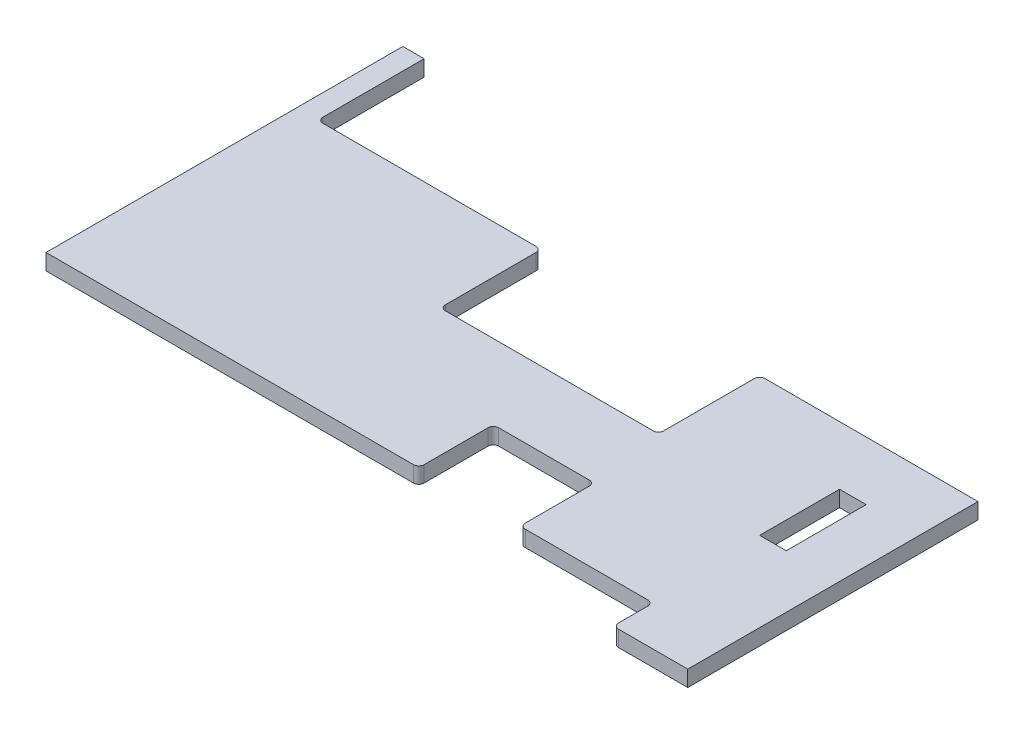
ISO-10303-21;
HEADER;
FILE_DESCRIPTION(('STEP AP214'),'2;1');
FILE_NAME('part.step','',(''),(''),'','','');
FILE_SCHEMA(('AUTOMOTIVE_DESIGN { 1 0 10303 214 1 1 1 1 }'));
ENDSEC;
DATA;
#1=APPLICATION_CONTEXT('core data for automotive mechanical design processes');
#2=APPLICATION_PROTOCOL_DEFINITION('international standard','automotive_design',2000,#1);
#3=PRODUCT_CONTEXT('',#1,'mechanical');
#4=PRODUCT('Part','Part','',(#3));
#5=PRODUCT_RELATED_PRODUCT_CATEGORY('part','',(#4));
#6=PRODUCT_DEFINITION_FORMATION('','',#4);
#7=PRODUCT_DEFINITION_CONTEXT('part definition',#1,'design');
#8=PRODUCT_DEFINITION('design','',#6,#7);
#9=PRODUCT_DEFINITION_SHAPE('','',#8);
#10=(LENGTH_UNIT() NAMED_UNIT(*) SI_UNIT(.MILLI.,.METRE.));
#11=(NAMED_UNIT(*) PLANE_ANGLE_UNIT() SI_UNIT($,.RADIAN.));
#12=(NAMED_UNIT(*) SI_UNIT($,.STERADIAN.) SOLID_ANGLE_UNIT());
#13=UNCERTAINTY_MEASURE_WITH_UNIT(LENGTH_MEASURE(1.E-05),#10,'distance_accuracy_value','');
#14=(GEOMETRIC_REPRESENTATION_CONTEXT(3) GLOBAL_UNCERTAINTY_ASSIGNED_CONTEXT((#13)) GLOBAL_UNIT_ASSIGNED_CONTEXT((#10,
#11,#12)) REPRESENTATION_CONTEXT('',''));
#15=CARTESIAN_POINT('',(0.,0.,0.));
#16=DIRECTION('',(0.,0.,1.));
#17=DIRECTION('',(1.,0.,0.));
#18=AXIS2_PLACEMENT_3D('',#15,#16,#17);
#19=CARTESIAN_POINT('',(0.,3.,-67.));
#20=DIRECTION('',(1.,0.,0.));
#21=DIRECTION('',(0.,0.,-1.));
#22=AXIS2_PLACEMENT_3D('',#19,#20,#21);
#23=PLANE('',#22);
#24=DIRECTION('',(0.,0.,1.));
#25=VECTOR('',#24,1.);
#26=CARTESIAN_POINT('',(0.,0.,-67.));
#27=LINE('',#26,#25);
#28=CARTESIAN_POINT('',(0.,0.,-67.));
#29=VERTEX_POINT('',#28);
#30=CARTESIAN_POINT('',(0.,0.,0.));
#31=VERTEX_POINT('',#30);
#32=EDGE_CURVE('E299',#29,#31,#27,.T.);
#33=ORIENTED_EDGE('',*,*,#32,.T.);
#34=DIRECTION('',(0.,-1.,0.));
#35=VECTOR('',#34,1.);
#36=CARTESIAN_POINT('',(0.,3.,0.));
#37=LINE('',#36,#35);
#38=CARTESIAN_POINT('',(0.,3.,0.));
#39=VERTEX_POINT('',#38);
#40=EDGE_CURVE('E438',#39,#31,#37,.T.);
#41=ORIENTED_EDGE('',*,*,#40,.F.);
#42=DIRECTION('',(0.,0.,1.));
#43=VECTOR('',#42,1.);
#44=CARTESIAN_POINT('',(0.,3.,-67.));
#45=LINE('',#44,#43);
#46=CARTESIAN_POINT('',(0.,3.,-67.));
#47=VERTEX_POINT('',#46);
#48=EDGE_CURVE('E305',#47,#39,#45,.T.);
#49=ORIENTED_EDGE('',*,*,#48,.F.);
#50=DIRECTION('',(0.,-1.,0.));
#51=VECTOR('',#50,1.);
#52=CARTESIAN_POINT('',(0.,3.,-67.));
#53=LINE('',#52,#51);
#54=EDGE_CURVE('E365',#47,#29,#53,.T.);
#55=ORIENTED_EDGE('',*,*,#54,.T.);
#56=EDGE_LOOP('',(#33,#41,#49,#55));
#57=FACE_BOUND('',#56,.T.);
#58=ADVANCED_FACE('F45',(#57),#23,.F.);
#59=CARTESIAN_POINT('',(70.,3.,0.));
#60=DIRECTION('',(0.,0.,-1.));
#61=DIRECTION('',(-1.,0.,0.));
#62=AXIS2_PLACEMENT_3D('',#59,#60,#61);
#63=PLANE('',#62);
#64=DIRECTION('',(1.,0.,0.));
#65=VECTOR('',#64,1.);
#66=CARTESIAN_POINT('',(70.,0.,0.));
#67=LINE('',#66,#65);
#68=CARTESIAN_POINT('',(69.,0.,0.));
#69=VERTEX_POINT('',#68);
#70=EDGE_CURVE('E369',#31,#69,#67,.T.);
#71=ORIENTED_EDGE('',*,*,#70,.T.);
#72=DIRECTION('',(0.,-1.,0.));
#73=VECTOR('',#72,1.);
#74=CARTESIAN_POINT('',(69.,3.,0.));
#75=LINE('',#74,#73);
#76=CARTESIAN_POINT('',(69.,3.,0.));
#77=VERTEX_POINT('',#76);
#78=EDGE_CURVE('E504',#69,#77,#75,.F.);
#79=ORIENTED_EDGE('',*,*,#78,.T.);
#80=DIRECTION('',(1.,0.,0.));
#81=VECTOR('',#80,1.);
#82=CARTESIAN_POINT('',(70.,3.,0.));
#83=LINE('',#82,#81);
#84=EDGE_CURVE('E309',#39,#77,#83,.T.);
#85=ORIENTED_EDGE('',*,*,#84,.F.);
#86=ORIENTED_EDGE('',*,*,#40,.T.);
#87=EDGE_LOOP('',(#71,#79,#85,#86));
#88=FACE_BOUND('',#87,.T.);
#89=ADVANCED_FACE('F599',(#88),#63,.F.);
#90=CARTESIAN_POINT('',(70.,3.,-14.));
#91=DIRECTION('',(-1.,0.,0.));
#92=DIRECTION('',(0.,0.,1.));
#93=AXIS2_PLACEMENT_3D('',#90,#91,#92);
#94=PLANE('',#93);
#95=DIRECTION('',(0.,0.,-1.));
#96=VECTOR('',#95,1.);
#97=CARTESIAN_POINT('',(70.,3.,-14.));
#98=LINE('',#97,#96);
#99=CARTESIAN_POINT('',(70.,3.,-1.));
#100=VERTEX_POINT('',#99);
#101=CARTESIAN_POINT('',(70.,3.,-13.));
#102=VERTEX_POINT('',#101);
#103=EDGE_CURVE('E314',#100,#102,#98,.T.);
#104=ORIENTED_EDGE('',*,*,#103,.F.);
#105=DIRECTION('',(0.,-1.,0.));
#106=VECTOR('',#105,1.);
#107=CARTESIAN_POINT('',(70.,3.,-1.));
#108=LINE('',#107,#106);
#109=CARTESIAN_POINT('',(70.,0.,-1.));
#110=VERTEX_POINT('',#109);
#111=EDGE_CURVE('E500',#100,#110,#108,.T.);
#112=ORIENTED_EDGE('',*,*,#111,.T.);
#113=DIRECTION('',(0.,0.,-1.));
#114=VECTOR('',#113,1.);
#115=CARTESIAN_POINT('',(70.,0.,-14.));
#116=LINE('',#115,#114);
#117=CARTESIAN_POINT('',(70.,0.,-13.));
#118=VERTEX_POINT('',#117);
#119=EDGE_CURVE('E373',#110,#118,#116,.T.);
#120=ORIENTED_EDGE('',*,*,#119,.T.);
#121=DIRECTION('',(0.,-1.,0.));
#122=VECTOR('',#121,1.);
#123=CARTESIAN_POINT('',(70.,3.,-13.));
#124=LINE('',#123,#122);
#125=EDGE_CURVE('E497',#118,#102,#124,.F.);
#126=ORIENTED_EDGE('',*,*,#125,.T.);
#127=EDGE_LOOP('',(#104,#112,#120,#126));
#128=FACE_BOUND('',#127,.T.);
#129=ADVANCED_FACE('F608',(#128),#94,.F.);
#130=CARTESIAN_POINT('',(89.,3.,-14.));
#131=DIRECTION('',(0.,0.,-1.));
#132=DIRECTION('',(-1.,0.,0.));
#133=AXIS2_PLACEMENT_3D('',#130,#131,#132);
#134=PLANE('',#133);
#135=DIRECTION('',(1.,0.,0.));
#136=VECTOR('',#135,1.);
#137=CARTESIAN_POINT('',(89.,0.,-14.));
#138=LINE('',#137,#136);
#139=CARTESIAN_POINT('',(71.,0.,-14.));
#140=VERTEX_POINT('',#139);
#141=CARTESIAN_POINT('',(88.,0.,-14.));
#142=VERTEX_POINT('',#141);
#143=EDGE_CURVE('E377',#140,#142,#138,.T.);
#144=ORIENTED_EDGE('',*,*,#143,.T.);
#145=DIRECTION('',(0.,-1.,0.));
#146=VECTOR('',#145,1.);
#147=CARTESIAN_POINT('',(88.,3.,-14.));
#148=LINE('',#147,#146);
#149=CARTESIAN_POINT('',(88.,3.,-14.));
#150=VERTEX_POINT('',#149);
#151=EDGE_CURVE('E511',#142,#150,#148,.F.);
#152=ORIENTED_EDGE('',*,*,#151,.T.);
#153=DIRECTION('',(1.,0.,0.));
#154=VECTOR('',#153,1.);
#155=CARTESIAN_POINT('',(89.,3.,-14.));
#156=LINE('',#155,#154);
#157=CARTESIAN_POINT('',(71.,3.,-14.));
#158=VERTEX_POINT('',#157);
#159=EDGE_CURVE('E318',#158,#150,#156,.T.);
#160=ORIENTED_EDGE('',*,*,#159,.F.);
#161=DIRECTION('',(0.,-1.,0.));
#162=VECTOR('',#161,1.);
#163=CARTESIAN_POINT('',(71.,0.,-14.));
#164=LINE('',#163,#162);
#165=EDGE_CURVE('E507',#158,#140,#164,.T.);
#166=ORIENTED_EDGE('',*,*,#165,.T.);
#167=EDGE_LOOP('',(#144,#152,#160,#166));
#168=FACE_BOUND('',#167,.T.);
#169=ADVANCED_FACE('F617',(#168),#134,.F.);
#170=CARTESIAN_POINT('',(89.,3.,0.));
#171=DIRECTION('',(1.,0.,0.));
#172=DIRECTION('',(0.,0.,-1.));
#173=AXIS2_PLACEMENT_3D('',#170,#171,#172);
#174=PLANE('',#173);
#175=DIRECTION('',(0.,0.,1.));
#176=VECTOR('',#175,1.);
#177=CARTESIAN_POINT('',(89.,0.,0.));
#178=LINE('',#177,#176);
#179=CARTESIAN_POINT('',(89.,0.,-13.));
#180=VERTEX_POINT('',#179);
#181=CARTESIAN_POINT('',(89.,0.,-1.));
#182=VERTEX_POINT('',#181);
#183=EDGE_CURVE('E381',#180,#182,#178,.T.);
#184=ORIENTED_EDGE('',*,*,#183,.T.);
#185=DIRECTION('',(0.,-1.,0.));
#186=VECTOR('',#185,1.);
#187=CARTESIAN_POINT('',(89.,3.,-1.));
#188=LINE('',#187,#186);
#189=CARTESIAN_POINT('',(89.,3.,-1.));
#190=VERTEX_POINT('',#189);
#191=EDGE_CURVE('E494',#182,#190,#188,.F.);
#192=ORIENTED_EDGE('',*,*,#191,.T.);
#193=DIRECTION('',(0.,0.,1.));
#194=VECTOR('',#193,1.);
#195=CARTESIAN_POINT('',(89.,3.,0.));
#196=LINE('',#195,#194);
#197=CARTESIAN_POINT('',(89.,3.,-13.));
#198=VERTEX_POINT('',#197);
#199=EDGE_CURVE('E322',#198,#190,#196,.T.);
#200=ORIENTED_EDGE('',*,*,#199,.F.);
#201=DIRECTION('',(0.,-1.,0.));
#202=VECTOR('',#201,1.);
#203=CARTESIAN_POINT('',(89.,0.,-13.));
#204=LINE('',#203,#202);
#205=EDGE_CURVE('E490',#198,#180,#204,.T.);
#206=ORIENTED_EDGE('',*,*,#205,.T.);
#207=EDGE_LOOP('',(#184,#192,#200,#206));
#208=FACE_BOUND('',#207,.T.);
#209=ADVANCED_FACE('F626',(#208),#174,.F.);
#210=CARTESIAN_POINT('',(114.,3.,0.));
#211=DIRECTION('',(0.,0.,-1.));
#212=DIRECTION('',(-1.,0.,0.));
#213=AXIS2_PLACEMENT_3D('',#210,#211,#212);
#214=PLANE('',#213);
#215=DIRECTION('',(1.,0.,0.));
#216=VECTOR('',#215,1.);
#217=CARTESIAN_POINT('',(114.,0.,0.));
#218=LINE('',#217,#216);
#219=CARTESIAN_POINT('',(90.,0.,0.));
#220=VERTEX_POINT('',#219);
#221=CARTESIAN_POINT('',(113.,0.,0.));
#222=VERTEX_POINT('',#221);
#223=EDGE_CURVE('E385',#220,#222,#218,.T.);
#224=ORIENTED_EDGE('',*,*,#223,.T.);
#225=DIRECTION('',(0.,-1.,0.));
#226=VECTOR('',#225,1.);
#227=CARTESIAN_POINT('',(113.,3.,0.));
#228=LINE('',#227,#226);
#229=CARTESIAN_POINT('',(113.,3.,0.));
#230=VERTEX_POINT('',#229);
#231=EDGE_CURVE('E487',#222,#230,#228,.F.);
#232=ORIENTED_EDGE('',*,*,#231,.T.);
#233=DIRECTION('',(1.,0.,0.));
#234=VECTOR('',#233,1.);
#235=CARTESIAN_POINT('',(114.,3.,0.));
#236=LINE('',#235,#234);
#237=CARTESIAN_POINT('',(90.,3.,0.));
#238=VERTEX_POINT('',#237);
#239=EDGE_CURVE('E326',#238,#230,#236,.T.);
#240=ORIENTED_EDGE('',*,*,#239,.F.);
#241=DIRECTION('',(0.,-1.,0.));
#242=VECTOR('',#241,1.);
#243=CARTESIAN_POINT('',(90.,3.,0.));
#244=LINE('',#243,#242);
#245=EDGE_CURVE('E483',#238,#220,#244,.T.);
#246=ORIENTED_EDGE('',*,*,#245,.T.);
#247=EDGE_LOOP('',(#224,#232,#240,#246));
#248=FACE_BOUND('',#247,.T.);
#249=ADVANCED_FACE('F635',(#248),#214,.F.);
#250=CARTESIAN_POINT('',(114.,3.,7.49999999999999));
#251=DIRECTION('',(1.,0.,0.));
#252=DIRECTION('',(0.,0.,-1.));
#253=AXIS2_PLACEMENT_3D('',#250,#251,#252);
#254=PLANE('',#253);
#255=DIRECTION('',(0.,0.,1.));
#256=VECTOR('',#255,1.);
#257=CARTESIAN_POINT('',(114.,0.,7.49999999999999));
#258=LINE('',#257,#256);
#259=CARTESIAN_POINT('',(114.,0.,1.));
#260=VERTEX_POINT('',#259);
#261=CARTESIAN_POINT('',(114.,0.,6.49999999999999));
#262=VERTEX_POINT('',#261);
#263=EDGE_CURVE('E389',#260,#262,#258,.T.);
#264=ORIENTED_EDGE('',*,*,#263,.T.);
#265=DIRECTION('',(0.,-1.,0.));
#266=VECTOR('',#265,1.);
#267=CARTESIAN_POINT('',(114.,3.,6.49999999999999));
#268=LINE('',#267,#266);
#269=CARTESIAN_POINT('',(114.,3.,6.49999999999999));
#270=VERTEX_POINT('',#269);
#271=EDGE_CURVE('E465',#262,#270,#268,.F.);
#272=ORIENTED_EDGE('',*,*,#271,.T.);
#273=DIRECTION('',(0.,0.,1.));
#274=VECTOR('',#273,1.);
#275=CARTESIAN_POINT('',(114.,3.,7.49999999999999));
#276=LINE('',#275,#274);
#277=CARTESIAN_POINT('',(114.,3.,1.));
#278=VERTEX_POINT('',#277);
#279=EDGE_CURVE('E330',#278,#270,#276,.T.);
#280=ORIENTED_EDGE('',*,*,#279,.F.);
#281=DIRECTION('',(0.,-1.,0.));
#282=VECTOR('',#281,1.);
#283=CARTESIAN_POINT('',(114.,0.,0.999999999999998));
#284=LINE('',#283,#282);
#285=EDGE_CURVE('E461',#278,#260,#284,.T.);
#286=ORIENTED_EDGE('',*,*,#285,.T.);
#287=EDGE_LOOP('',(#264,#272,#280,#286));
#288=FACE_BOUND('',#287,.T.);
#289=ADVANCED_FACE('F644',(#288),#254,.F.);
#290=CARTESIAN_POINT('',(128.,3.,7.49999999999999));
#291=DIRECTION('',(0.,0.,-1.));
#292=DIRECTION('',(-1.,0.,0.));
#293=AXIS2_PLACEMENT_3D('',#290,#291,#292);
#294=PLANE('',#293);
#295=DIRECTION('',(1.,0.,0.));
#296=VECTOR('',#295,1.);
#297=CARTESIAN_POINT('',(128.,3.,7.49999999999999));
#298=LINE('',#297,#296);
#299=CARTESIAN_POINT('',(115.,3.,7.49999999999999));
#300=VERTEX_POINT('',#299);
#301=CARTESIAN_POINT('',(128.,3.,7.49999999999999));
#302=VERTEX_POINT('',#301);
#303=EDGE_CURVE('E334',#300,#302,#298,.T.);
#304=ORIENTED_EDGE('',*,*,#303,.F.);
#305=DIRECTION('',(0.,-1.,0.));
#306=VECTOR('',#305,1.);
#307=CARTESIAN_POINT('',(115.,3.,7.49999999999999));
#308=LINE('',#307,#306);
#309=CARTESIAN_POINT('',(115.,0.,7.49999999999999));
#310=VERTEX_POINT('',#309);
#311=EDGE_CURVE('E442',#300,#310,#308,.T.);
#312=ORIENTED_EDGE('',*,*,#311,.T.);
#313=DIRECTION('',(1.,0.,0.));
#314=VECTOR('',#313,1.);
#315=CARTESIAN_POINT('',(128.,0.,7.49999999999999));
#316=LINE('',#315,#314);
#317=CARTESIAN_POINT('',(128.,0.,7.49999999999999));
#318=VERTEX_POINT('',#317);
#319=EDGE_CURVE('E393',#310,#318,#316,.T.);
#320=ORIENTED_EDGE('',*,*,#319,.T.);
#321=DIRECTION('',(0.,-1.,0.));
#322=VECTOR('',#321,1.);
#323=CARTESIAN_POINT('',(128.,3.,7.49999999999999));
#324=LINE('',#323,#322);
#325=EDGE_CURVE('E434',#302,#318,#324,.T.);
#326=ORIENTED_EDGE('',*,*,#325,.F.);
#327=EDGE_LOOP('',(#304,#312,#320,#326));
#328=FACE_BOUND('',#327,.T.);
#329=ADVANCED_FACE('F653',(#328),#294,.F.);
#330=CARTESIAN_POINT('',(128.,3.,-47.));
#331=DIRECTION('',(-1.,0.,0.));
#332=DIRECTION('',(0.,0.,1.));
#333=AXIS2_PLACEMENT_3D('',#330,#331,#332);
#334=PLANE('',#333);
#335=DIRECTION('',(0.,0.,-1.));
#336=VECTOR('',#335,1.);
#337=CARTESIAN_POINT('',(128.,0.,-47.));
#338=LINE('',#337,#336);
#339=CARTESIAN_POINT('',(128.,0.,-47.));
#340=VERTEX_POINT('',#339);
#341=EDGE_CURVE('E396',#318,#340,#338,.T.);
#342=ORIENTED_EDGE('',*,*,#341,.T.);
#343=DIRECTION('',(0.,-1.,0.));
#344=VECTOR('',#343,1.);
#345=CARTESIAN_POINT('',(128.,3.,-47.));
#346=LINE('',#345,#344);
#347=CARTESIAN_POINT('',(128.,3.,-47.));
#348=VERTEX_POINT('',#347);
#349=EDGE_CURVE('E430',#348,#340,#346,.T.);
#350=ORIENTED_EDGE('',*,*,#349,.F.);
#351=DIRECTION('',(0.,0.,-1.));
#352=VECTOR('',#351,1.);
#353=CARTESIAN_POINT('',(128.,3.,-47.));
#354=LINE('',#353,#352);
#355=EDGE_CURVE('E337',#302,#348,#354,.T.);
#356=ORIENTED_EDGE('',*,*,#355,.F.);
#357=ORIENTED_EDGE('',*,*,#325,.T.);
#358=EDGE_LOOP('',(#342,#350,#356,#357));
#359=FACE_BOUND('',#358,.T.);
#360=ADVANCED_FACE('F660',(#359),#334,.F.);
#361=CARTESIAN_POINT('',(87.,3.,-47.));
#362=DIRECTION('',(0.,0.,1.));
#363=DIRECTION('',(1.,0.,0.));
#364=AXIS2_PLACEMENT_3D('',#361,#362,#363);
#365=PLANE('',#364);
#366=DIRECTION('',(-1.,0.,0.));
#367=VECTOR('',#366,1.);
#368=CARTESIAN_POINT('',(87.,0.,-47.));
#369=LINE('',#368,#367);
#370=CARTESIAN_POINT('',(88.,0.,-47.));
#371=VERTEX_POINT('',#370);
#372=EDGE_CURVE('E399',#340,#371,#369,.T.);
#373=ORIENTED_EDGE('',*,*,#372,.T.);
#374=DIRECTION('',(0.,-1.,0.));
#375=VECTOR('',#374,1.);
#376=CARTESIAN_POINT('',(88.,3.,-47.));
#377=LINE('',#376,#375);
#378=CARTESIAN_POINT('',(88.,3.,-47.));
#379=VERTEX_POINT('',#378);
#380=EDGE_CURVE('E521',#371,#379,#377,.F.);
#381=ORIENTED_EDGE('',*,*,#380,.T.);
#382=DIRECTION('',(-1.,0.,0.));
#383=VECTOR('',#382,1.);
#384=CARTESIAN_POINT('',(87.,3.,-47.));
#385=LINE('',#384,#383);
#386=EDGE_CURVE('E340',#348,#379,#385,.T.);
#387=ORIENTED_EDGE('',*,*,#386,.F.);
#388=ORIENTED_EDGE('',*,*,#349,.T.);
#389=EDGE_LOOP('',(#373,#381,#387,#388));
#390=FACE_BOUND('',#389,.T.);
#391=ADVANCED_FACE('F663',(#390),#365,.F.);
#392=CARTESIAN_POINT('',(87.,3.,-28.));
#393=DIRECTION('',(1.,0.,0.));
#394=DIRECTION('',(0.,0.,-1.));
#395=AXIS2_PLACEMENT_3D('',#392,#393,#394);
#396=PLANE('',#395);
#397=DIRECTION('',(0.,0.,1.));
#398=VECTOR('',#397,1.);
#399=CARTESIAN_POINT('',(87.,3.,-28.));
#400=LINE('',#399,#398);
#401=CARTESIAN_POINT('',(87.,3.,-46.));
#402=VERTEX_POINT('',#401);
#403=CARTESIAN_POINT('',(87.,3.,-29.));
#404=VERTEX_POINT('',#403);
#405=EDGE_CURVE('E344',#402,#404,#400,.T.);
#406=ORIENTED_EDGE('',*,*,#405,.F.);
#407=DIRECTION('',(0.,-1.,0.));
#408=VECTOR('',#407,1.);
#409=CARTESIAN_POINT('',(87.,3.,-46.));
#410=LINE('',#409,#408);
#411=CARTESIAN_POINT('',(87.,0.,-46.));
#412=VERTEX_POINT('',#411);
#413=EDGE_CURVE('E517',#402,#412,#410,.T.);
#414=ORIENTED_EDGE('',*,*,#413,.T.);
#415=DIRECTION('',(0.,0.,1.));
#416=VECTOR('',#415,1.);
#417=CARTESIAN_POINT('',(87.,0.,-28.));
#418=LINE('',#417,#416);
#419=CARTESIAN_POINT('',(87.,0.,-29.));
#420=VERTEX_POINT('',#419);
#421=EDGE_CURVE('E403',#412,#420,#418,.T.);
#422=ORIENTED_EDGE('',*,*,#421,.T.);
#423=DIRECTION('',(0.,-1.,0.));
#424=VECTOR('',#423,1.);
#425=CARTESIAN_POINT('',(87.,3.,-29.));
#426=LINE('',#425,#424);
#427=EDGE_CURVE('E514',#420,#404,#426,.F.);
#428=ORIENTED_EDGE('',*,*,#427,.T.);
#429=EDGE_LOOP('',(#406,#414,#422,#428));
#430=FACE_BOUND('',#429,.T.);
#431=ADVANCED_FACE('F671',(#430),#396,.F.);
#432=CARTESIAN_POINT('',(46.,3.,-28.));
#433=DIRECTION('',(0.,0.,1.));
#434=DIRECTION('',(1.,0.,0.));
#435=AXIS2_PLACEMENT_3D('',#432,#433,#434);
#436=PLANE('',#435);
#437=DIRECTION('',(-1.,0.,0.));
#438=VECTOR('',#437,1.);
#439=CARTESIAN_POINT('',(46.,3.,-28.));
#440=LINE('',#439,#438);
#441=CARTESIAN_POINT('',(86.,3.,-28.));
#442=VERTEX_POINT('',#441);
#443=CARTESIAN_POINT('',(47.,3.,-28.));
#444=VERTEX_POINT('',#443);
#445=EDGE_CURVE('E348',#442,#444,#440,.T.);
#446=ORIENTED_EDGE('',*,*,#445,.F.);
#447=DIRECTION('',(0.,-1.,0.));
#448=VECTOR('',#447,1.);
#449=CARTESIAN_POINT('',(86.,0.,-28.));
#450=LINE('',#449,#448);
#451=CARTESIAN_POINT('',(86.,0.,-28.));
#452=VERTEX_POINT('',#451);
#453=EDGE_CURVE('E527',#442,#452,#450,.T.);
#454=ORIENTED_EDGE('',*,*,#453,.T.);
#455=DIRECTION('',(-1.,0.,0.));
#456=VECTOR('',#455,1.);
#457=CARTESIAN_POINT('',(46.,0.,-28.));
#458=LINE('',#457,#456);
#459=CARTESIAN_POINT('',(47.,0.,-28.));
#460=VERTEX_POINT('',#459);
#461=EDGE_CURVE('E407',#452,#460,#458,.T.);
#462=ORIENTED_EDGE('',*,*,#461,.T.);
#463=DIRECTION('',(0.,-1.,0.));
#464=VECTOR('',#463,1.);
#465=CARTESIAN_POINT('',(47.,3.,-28.));
#466=LINE('',#465,#464);
#467=EDGE_CURVE('E524',#460,#444,#466,.F.);
#468=ORIENTED_EDGE('',*,*,#467,.T.);
#469=EDGE_LOOP('',(#446,#454,#462,#468));
#470=FACE_BOUND('',#469,.T.);
#471=ADVANCED_FACE('F680',(#470),#436,.F.);
#472=CARTESIAN_POINT('',(46.,3.,-47.));
#473=DIRECTION('',(-1.,0.,0.));
#474=DIRECTION('',(0.,0.,1.));
#475=AXIS2_PLACEMENT_3D('',#472,#473,#474);
#476=PLANE('',#475);
#477=DIRECTION('',(0.,0.,-1.));
#478=VECTOR('',#477,1.);
#479=CARTESIAN_POINT('',(46.,3.,-47.));
#480=LINE('',#479,#478);
#481=CARTESIAN_POINT('',(46.,3.,-29.));
#482=VERTEX_POINT('',#481);
#483=CARTESIAN_POINT('',(46.,3.,-46.));
#484=VERTEX_POINT('',#483);
#485=EDGE_CURVE('E352',#482,#484,#480,.T.);
#486=ORIENTED_EDGE('',*,*,#485,.F.);
#487=DIRECTION('',(0.,-1.,0.));
#488=VECTOR('',#487,1.);
#489=CARTESIAN_POINT('',(46.,0.,-29.));
#490=LINE('',#489,#488);
#491=CARTESIAN_POINT('',(46.,0.,-29.));
#492=VERTEX_POINT('',#491);
#493=EDGE_CURVE('E534',#482,#492,#490,.T.);
#494=ORIENTED_EDGE('',*,*,#493,.T.);
#495=DIRECTION('',(0.,0.,-1.));
#496=VECTOR('',#495,1.);
#497=CARTESIAN_POINT('',(46.,0.,-47.));
#498=LINE('',#497,#496);
#499=CARTESIAN_POINT('',(46.,0.,-46.));
#500=VERTEX_POINT('',#499);
#501=EDGE_CURVE('E411',#492,#500,#498,.T.);
#502=ORIENTED_EDGE('',*,*,#501,.T.);
#503=DIRECTION('',(0.,-1.,0.));
#504=VECTOR('',#503,1.);
#505=CARTESIAN_POINT('',(46.,3.,-46.));
#506=LINE('',#505,#504);
#507=EDGE_CURVE('E531',#500,#484,#506,.F.);
#508=ORIENTED_EDGE('',*,*,#507,.T.);
#509=EDGE_LOOP('',(#486,#494,#502,#508));
#510=FACE_BOUND('',#509,.T.);
#511=ADVANCED_FACE('F689',(#510),#476,.F.);
#512=CARTESIAN_POINT('',(4.,3.,-47.));
#513=DIRECTION('',(0.,0.,1.));
#514=DIRECTION('',(1.,0.,0.));
#515=AXIS2_PLACEMENT_3D('',#512,#513,#514);
#516=PLANE('',#515);
#517=DIRECTION('',(-1.,0.,0.));
#518=VECTOR('',#517,1.);
#519=CARTESIAN_POINT('',(4.,3.,-47.));
#520=LINE('',#519,#518);
#521=CARTESIAN_POINT('',(45.,3.,-47.));
#522=VERTEX_POINT('',#521);
#523=CARTESIAN_POINT('',(5.,3.,-47.));
#524=VERTEX_POINT('',#523);
#525=EDGE_CURVE('E356',#522,#524,#520,.T.);
#526=ORIENTED_EDGE('',*,*,#525,.F.);
#527=DIRECTION('',(0.,-1.,0.));
#528=VECTOR('',#527,1.);
#529=CARTESIAN_POINT('',(45.,3.,-47.));
#530=LINE('',#529,#528);
#531=CARTESIAN_POINT('',(45.,0.,-47.));
#532=VERTEX_POINT('',#531);
#533=EDGE_CURVE('E540',#522,#532,#530,.T.);
#534=ORIENTED_EDGE('',*,*,#533,.T.);
#535=DIRECTION('',(-1.,0.,0.));
#536=VECTOR('',#535,1.);
#537=CARTESIAN_POINT('',(4.,0.,-47.));
#538=LINE('',#537,#536);
#539=CARTESIAN_POINT('',(5.,0.,-47.));
#540=VERTEX_POINT('',#539);
#541=EDGE_CURVE('E415',#532,#540,#538,.T.);
#542=ORIENTED_EDGE('',*,*,#541,.T.);
#543=DIRECTION('',(0.,-1.,0.));
#544=VECTOR('',#543,1.);
#545=CARTESIAN_POINT('',(5.,3.,-47.));
#546=LINE('',#545,#544);
#547=EDGE_CURVE('E67',#540,#524,#546,.F.);
#548=ORIENTED_EDGE('',*,*,#547,.T.);
#549=EDGE_LOOP('',(#526,#534,#542,#548));
#550=FACE_BOUND('',#549,.T.);
#551=ADVANCED_FACE('F584',(#550),#516,.F.);
#552=CARTESIAN_POINT('',(4.,3.,-67.));
#553=DIRECTION('',(-1.,0.,0.));
#554=DIRECTION('',(0.,0.,1.));
#555=AXIS2_PLACEMENT_3D('',#552,#553,#554);
#556=PLANE('',#555);
#557=DIRECTION('',(0.,0.,-1.));
#558=VECTOR('',#557,1.);
#559=CARTESIAN_POINT('',(4.,3.,-67.));
#560=LINE('',#559,#558);
#561=CARTESIAN_POINT('',(4.,3.,-48.));
#562=VERTEX_POINT('',#561);
#563=CARTESIAN_POINT('',(4.,3.,-67.));
#564=VERTEX_POINT('',#563);
#565=EDGE_CURVE('E359',#562,#564,#560,.T.);
#566=ORIENTED_EDGE('',*,*,#565,.F.);
#567=DIRECTION('',(0.,-1.,0.));
#568=VECTOR('',#567,1.);
#569=CARTESIAN_POINT('',(4.,0.,-48.));
#570=LINE('',#569,#568);
#571=CARTESIAN_POINT('',(4.,0.,-48.));
#572=VERTEX_POINT('',#571);
#573=EDGE_CURVE('E544',#562,#572,#570,.T.);
#574=ORIENTED_EDGE('',*,*,#573,.T.);
#575=DIRECTION('',(0.,0.,-1.));
#576=VECTOR('',#575,1.);
#577=CARTESIAN_POINT('',(4.,0.,-67.));
#578=LINE('',#577,#576);
#579=CARTESIAN_POINT('',(4.,0.,-67.));
#580=VERTEX_POINT('',#579);
#581=EDGE_CURVE('E418',#572,#580,#578,.T.);
#582=ORIENTED_EDGE('',*,*,#581,.T.);
#583=DIRECTION('',(0.,-1.,0.));
#584=VECTOR('',#583,1.);
#585=CARTESIAN_POINT('',(4.,3.,-67.));
#586=LINE('',#585,#584);
#587=EDGE_CURVE('E426',#564,#580,#586,.T.);
#588=ORIENTED_EDGE('',*,*,#587,.F.);
#589=EDGE_LOOP('',(#566,#574,#582,#588));
#590=FACE_BOUND('',#589,.T.);
#591=ADVANCED_FACE('F587',(#590),#556,.F.);
#592=CARTESIAN_POINT('',(0.,3.,-67.));
#593=DIRECTION('',(0.,0.,1.));
#594=DIRECTION('',(1.,0.,0.));
#595=AXIS2_PLACEMENT_3D('',#592,#593,#594);
#596=PLANE('',#595);
#597=DIRECTION('',(-1.,0.,0.));
#598=VECTOR('',#597,1.);
#599=CARTESIAN_POINT('',(0.,0.,-67.));
#600=LINE('',#599,#598);
#601=EDGE_CURVE('E310',#580,#29,#600,.T.);
#602=ORIENTED_EDGE('',*,*,#601,.T.);
#603=ORIENTED_EDGE('',*,*,#54,.F.);
#604=DIRECTION('',(-1.,0.,0.));
#605=VECTOR('',#604,1.);
#606=CARTESIAN_POINT('',(0.,3.,-67.));
#607=LINE('',#606,#605);
#608=EDGE_CURVE('E362',#564,#47,#607,.T.);
#609=ORIENTED_EDGE('',*,*,#608,.F.);
#610=ORIENTED_EDGE('',*,*,#587,.T.);
#611=EDGE_LOOP('',(#602,#603,#609,#610));
#612=FACE_BOUND('',#611,.T.);
#613=ADVANCED_FACE('F595',(#612),#596,.F.);
#614=CARTESIAN_POINT('',(0.,3.,0.));
#615=DIRECTION('',(0.,-1.,0.));
#616=DIRECTION('',(0.,0.,-1.));
#617=AXIS2_PLACEMENT_3D('',#614,#615,#616);
#618=PLANE('',#617);
#619=DIRECTION('',(1.,0.,0.));
#620=VECTOR('',#619,1.);
#621=CARTESIAN_POINT('',(113.,3.,-21.));
#622=LINE('',#621,#620);
#623=CARTESIAN_POINT('',(113.,3.,-21.));
#624=VERTEX_POINT('',#623);
#625=CARTESIAN_POINT('',(118.,3.,-21.));
#626=VERTEX_POINT('',#625);
#627=EDGE_CURVE('E290',#624,#626,#622,.T.);
#628=ORIENTED_EDGE('',*,*,#627,.F.);
#629=DIRECTION('',(0.,0.,1.));
#630=VECTOR('',#629,1.);
#631=CARTESIAN_POINT('',(113.,3.,-36.));
#632=LINE('',#631,#630);
#633=CARTESIAN_POINT('',(113.,3.,-36.));
#634=VERTEX_POINT('',#633);
#635=EDGE_CURVE('E256',#634,#624,#632,.T.);
#636=ORIENTED_EDGE('',*,*,#635,.F.);
#637=DIRECTION('',(-1.,0.,0.));
#638=VECTOR('',#637,1.);
#639=CARTESIAN_POINT('',(113.,3.,-36.));
#640=LINE('',#639,#638);
#641=CARTESIAN_POINT('',(118.,3.,-36.));
#642=VERTEX_POINT('',#641);
#643=EDGE_CURVE('E277',#642,#634,#640,.T.);
#644=ORIENTED_EDGE('',*,*,#643,.F.);
#645=DIRECTION('',(0.,0.,-1.));
#646=VECTOR('',#645,1.);
#647=CARTESIAN_POINT('',(118.,3.,-36.));
#648=LINE('',#647,#646);
#649=EDGE_CURVE('E281',#626,#642,#648,.T.);
#650=ORIENTED_EDGE('',*,*,#649,.F.);
#651=EDGE_LOOP('',(#628,#636,#644,#650));
#652=FACE_BOUND('',#651,.T.);
#653=ORIENTED_EDGE('',*,*,#279,.T.);
#654=CARTESIAN_POINT('',(115.,3.,6.49999999999999));
#655=DIRECTION('',(0.,-1.,0.));
#656=DIRECTION('',(0.,0.,-1.));
#657=AXIS2_PLACEMENT_3D('',#654,#655,#656);
#658=CIRCLE('',#657,1.);
#659=EDGE_CURVE('E480',#270,#300,#658,.F.);
#660=ORIENTED_EDGE('',*,*,#659,.T.);
#661=ORIENTED_EDGE('',*,*,#303,.T.);
#662=ORIENTED_EDGE('',*,*,#355,.T.);
#663=ORIENTED_EDGE('',*,*,#386,.T.);
#664=CARTESIAN_POINT('',(88.,3.,-46.));
#665=DIRECTION('',(0.,-1.,0.));
#666=DIRECTION('',(0.,0.,-1.));
#667=AXIS2_PLACEMENT_3D('',#664,#665,#666);
#668=CIRCLE('',#667,1.);
#669=EDGE_CURVE('E471',#379,#402,#668,.F.);
#670=ORIENTED_EDGE('',*,*,#669,.T.);
#671=ORIENTED_EDGE('',*,*,#405,.T.);
#672=CARTESIAN_POINT('',(86.,3.,-29.));
#673=DIRECTION('',(0.,-1.,0.));
#674=DIRECTION('',(0.,0.,-1.));
#675=AXIS2_PLACEMENT_3D('',#672,#673,#674);
#676=CIRCLE('',#675,1.);
#677=EDGE_CURVE('E569',#404,#442,#676,.T.);
#678=ORIENTED_EDGE('',*,*,#677,.T.);
#679=ORIENTED_EDGE('',*,*,#445,.T.);
#680=CARTESIAN_POINT('',(47.,3.,-29.));
#681=DIRECTION('',(0.,-1.,0.));
#682=DIRECTION('',(0.,0.,-1.));
#683=AXIS2_PLACEMENT_3D('',#680,#681,#682);
#684=CIRCLE('',#683,1.);
#685=EDGE_CURVE('E575',#444,#482,#684,.T.);
#686=ORIENTED_EDGE('',*,*,#685,.T.);
#687=ORIENTED_EDGE('',*,*,#485,.T.);
#688=CARTESIAN_POINT('',(45.,3.,-46.));
#689=DIRECTION('',(0.,-1.,0.));
#690=DIRECTION('',(0.,0.,-1.));
#691=AXIS2_PLACEMENT_3D('',#688,#689,#690);
#692=CIRCLE('',#691,1.);
#693=EDGE_CURVE('E468',#484,#522,#692,.F.);
#694=ORIENTED_EDGE('',*,*,#693,.T.);
#695=ORIENTED_EDGE('',*,*,#525,.T.);
#696=CARTESIAN_POINT('',(5.,3.,-48.));
#697=DIRECTION('',(0.,-1.,0.));
#698=DIRECTION('',(0.,0.,-1.));
#699=AXIS2_PLACEMENT_3D('',#696,#697,#698);
#700=CIRCLE('',#699,1.);
#701=EDGE_CURVE('E11',#524,#562,#700,.T.);
#702=ORIENTED_EDGE('',*,*,#701,.T.);
#703=ORIENTED_EDGE('',*,*,#565,.T.);
#704=ORIENTED_EDGE('',*,*,#608,.T.);
#705=ORIENTED_EDGE('',*,*,#48,.T.);
#706=ORIENTED_EDGE('',*,*,#84,.T.);
#707=CARTESIAN_POINT('',(69.,3.,-1.));
#708=DIRECTION('',(0.,-1.,0.));
#709=DIRECTION('',(0.,0.,-1.));
#710=AXIS2_PLACEMENT_3D('',#707,#708,#709);
#711=CIRCLE('',#710,1.);
#712=EDGE_CURVE('E474',#77,#100,#711,.F.);
#713=ORIENTED_EDGE('',*,*,#712,.T.);
#714=ORIENTED_EDGE('',*,*,#103,.T.);
#715=CARTESIAN_POINT('',(71.,3.,-13.));
#716=DIRECTION('',(0.,-1.,0.));
#717=DIRECTION('',(0.,0.,-1.));
#718=AXIS2_PLACEMENT_3D('',#715,#716,#717);
#719=CIRCLE('',#718,1.);
#720=EDGE_CURVE('E563',#102,#158,#719,.T.);
#721=ORIENTED_EDGE('',*,*,#720,.T.);
#722=ORIENTED_EDGE('',*,*,#159,.T.);
#723=CARTESIAN_POINT('',(88.,3.,-13.));
#724=DIRECTION('',(0.,-1.,0.));
#725=DIRECTION('',(0.,0.,-1.));
#726=AXIS2_PLACEMENT_3D('',#723,#724,#725);
#727=CIRCLE('',#726,1.);
#728=EDGE_CURVE('E557',#150,#198,#727,.T.);
#729=ORIENTED_EDGE('',*,*,#728,.T.);
#730=ORIENTED_EDGE('',*,*,#199,.T.);
#731=CARTESIAN_POINT('',(90.,3.,-1.));
#732=DIRECTION('',(0.,-1.,0.));
#733=DIRECTION('',(0.,0.,-1.));
#734=AXIS2_PLACEMENT_3D('',#731,#732,#733);
#735=CIRCLE('',#734,1.);
#736=EDGE_CURVE('E477',#190,#238,#735,.F.);
#737=ORIENTED_EDGE('',*,*,#736,.T.);
#738=ORIENTED_EDGE('',*,*,#239,.T.);
#739=CARTESIAN_POINT('',(113.,3.,0.999999999999998));
#740=DIRECTION('',(0.,-1.,0.));
#741=DIRECTION('',(0.,0.,-1.));
#742=AXIS2_PLACEMENT_3D('',#739,#740,#741);
#743=CIRCLE('',#742,1.);
#744=EDGE_CURVE('E551',#230,#278,#743,.T.);
#745=ORIENTED_EDGE('',*,*,#744,.T.);
#746=EDGE_LOOP('',(#653,#660,#661,#662,#663,#670,#671,#678,#679,#686,#687,#694,#695,#702,#703,
#704,#705,#706,#713,#714,#721,#722,#729,#730,#737,#738,#745));
#747=FACE_BOUND('',#746,.T.);
#748=ADVANCED_FACE('F590',(#652,#747),#618,.F.);
#749=CARTESIAN_POINT('',(0.,0.,0.));
#750=DIRECTION('',(0.,-1.,0.));
#751=DIRECTION('',(0.,0.,-1.));
#752=AXIS2_PLACEMENT_3D('',#749,#750,#751);
#753=PLANE('',#752);
#754=DIRECTION('',(0.,0.,1.));
#755=VECTOR('',#754,1.);
#756=CARTESIAN_POINT('',(113.,0.,-36.));
#757=LINE('',#756,#755);
#758=CARTESIAN_POINT('',(113.,0.,-36.));
#759=VERTEX_POINT('',#758);
#760=CARTESIAN_POINT('',(113.,0.,-21.));
#761=VERTEX_POINT('',#760);
#762=EDGE_CURVE('E253',#759,#761,#757,.T.);
#763=ORIENTED_EDGE('',*,*,#762,.T.);
#764=DIRECTION('',(1.,0.,0.));
#765=VECTOR('',#764,1.);
#766=CARTESIAN_POINT('',(113.,0.,-21.));
#767=LINE('',#766,#765);
#768=CARTESIAN_POINT('',(118.,0.,-21.));
#769=VERTEX_POINT('',#768);
#770=EDGE_CURVE('E266',#761,#769,#767,.T.);
#771=ORIENTED_EDGE('',*,*,#770,.T.);
#772=DIRECTION('',(0.,0.,-1.));
#773=VECTOR('',#772,1.);
#774=CARTESIAN_POINT('',(118.,0.,-36.));
#775=LINE('',#774,#773);
#776=CARTESIAN_POINT('',(118.,0.,-36.));
#777=VERTEX_POINT('',#776);
#778=EDGE_CURVE('E271',#769,#777,#775,.T.);
#779=ORIENTED_EDGE('',*,*,#778,.T.);
#780=DIRECTION('',(-1.,0.,0.));
#781=VECTOR('',#780,1.);
#782=CARTESIAN_POINT('',(113.,0.,-36.));
#783=LINE('',#782,#781);
#784=EDGE_CURVE('E262',#777,#759,#783,.T.);
#785=ORIENTED_EDGE('',*,*,#784,.T.);
#786=EDGE_LOOP('',(#763,#771,#779,#785));
#787=FACE_BOUND('',#786,.T.);
#788=ORIENTED_EDGE('',*,*,#319,.F.);
#789=CARTESIAN_POINT('',(115.,0.,6.49999999999999));
#790=DIRECTION('',(0.,-1.,0.));
#791=DIRECTION('',(0.,0.,-1.));
#792=AXIS2_PLACEMENT_3D('',#789,#790,#791);
#793=CIRCLE('',#792,1.);
#794=EDGE_CURVE('E458',#310,#262,#793,.T.);
#795=ORIENTED_EDGE('',*,*,#794,.T.);
#796=ORIENTED_EDGE('',*,*,#263,.F.);
#797=CARTESIAN_POINT('',(113.,0.,0.999999999999998));
#798=DIRECTION('',(0.,-1.,0.));
#799=DIRECTION('',(0.,0.,-1.));
#800=AXIS2_PLACEMENT_3D('',#797,#798,#799);
#801=CIRCLE('',#800,1.);
#802=EDGE_CURVE('E548',#260,#222,#801,.F.);
#803=ORIENTED_EDGE('',*,*,#802,.T.);
#804=ORIENTED_EDGE('',*,*,#223,.F.);
#805=CARTESIAN_POINT('',(90.,0.,-1.));
#806=DIRECTION('',(0.,-1.,0.));
#807=DIRECTION('',(0.,0.,-1.));
#808=AXIS2_PLACEMENT_3D('',#805,#806,#807);
#809=CIRCLE('',#808,1.);
#810=EDGE_CURVE('E455',#220,#182,#809,.T.);
#811=ORIENTED_EDGE('',*,*,#810,.T.);
#812=ORIENTED_EDGE('',*,*,#183,.F.);
#813=CARTESIAN_POINT('',(88.,0.,-13.));
#814=DIRECTION('',(0.,-1.,0.));
#815=DIRECTION('',(0.,0.,-1.));
#816=AXIS2_PLACEMENT_3D('',#813,#814,#815);
#817=CIRCLE('',#816,1.);
#818=EDGE_CURVE('E554',#180,#142,#817,.F.);
#819=ORIENTED_EDGE('',*,*,#818,.T.);
#820=ORIENTED_EDGE('',*,*,#143,.F.);
#821=CARTESIAN_POINT('',(71.,0.,-13.));
#822=DIRECTION('',(0.,-1.,0.));
#823=DIRECTION('',(0.,0.,-1.));
#824=AXIS2_PLACEMENT_3D('',#821,#822,#823);
#825=CIRCLE('',#824,1.);
#826=EDGE_CURVE('E560',#140,#118,#825,.F.);
#827=ORIENTED_EDGE('',*,*,#826,.T.);
#828=ORIENTED_EDGE('',*,*,#119,.F.);
#829=CARTESIAN_POINT('',(69.,0.,-1.));
#830=DIRECTION('',(0.,-1.,0.));
#831=DIRECTION('',(0.,0.,-1.));
#832=AXIS2_PLACEMENT_3D('',#829,#830,#831);
#833=CIRCLE('',#832,1.);
#834=EDGE_CURVE('E452',#110,#69,#833,.T.);
#835=ORIENTED_EDGE('',*,*,#834,.T.);
#836=ORIENTED_EDGE('',*,*,#70,.F.);
#837=ORIENTED_EDGE('',*,*,#32,.F.);
#838=ORIENTED_EDGE('',*,*,#601,.F.);
#839=ORIENTED_EDGE('',*,*,#581,.F.);
#840=CARTESIAN_POINT('',(5.,0.,-48.));
#841=DIRECTION('',(0.,-1.,0.));
#842=DIRECTION('',(0.,0.,-1.));
#843=AXIS2_PLACEMENT_3D('',#840,#841,#842);
#844=CIRCLE('',#843,1.);
#845=EDGE_CURVE('E54',#572,#540,#844,.F.);
#846=ORIENTED_EDGE('',*,*,#845,.T.);
#847=ORIENTED_EDGE('',*,*,#541,.F.);
#848=CARTESIAN_POINT('',(45.,0.,-46.));
#849=DIRECTION('',(0.,-1.,0.));
#850=DIRECTION('',(0.,0.,-1.));
#851=AXIS2_PLACEMENT_3D('',#848,#849,#850);
#852=CIRCLE('',#851,1.);
#853=EDGE_CURVE('E446',#532,#500,#852,.T.);
#854=ORIENTED_EDGE('',*,*,#853,.T.);
#855=ORIENTED_EDGE('',*,*,#501,.F.);
#856=CARTESIAN_POINT('',(47.,0.,-29.));
#857=DIRECTION('',(0.,-1.,0.));
#858=DIRECTION('',(0.,0.,-1.));
#859=AXIS2_PLACEMENT_3D('',#856,#857,#858);
#860=CIRCLE('',#859,1.);
#861=EDGE_CURVE('E572',#492,#460,#860,.F.);
#862=ORIENTED_EDGE('',*,*,#861,.T.);
#863=ORIENTED_EDGE('',*,*,#461,.F.);
#864=CARTESIAN_POINT('',(86.,0.,-29.));
#865=DIRECTION('',(0.,-1.,0.));
#866=DIRECTION('',(0.,0.,-1.));
#867=AXIS2_PLACEMENT_3D('',#864,#865,#866);
#868=CIRCLE('',#867,1.);
#869=EDGE_CURVE('E566',#452,#420,#868,.F.);
#870=ORIENTED_EDGE('',*,*,#869,.T.);
#871=ORIENTED_EDGE('',*,*,#421,.F.);
#872=CARTESIAN_POINT('',(88.,0.,-46.));
#873=DIRECTION('',(0.,-1.,0.));
#874=DIRECTION('',(0.,0.,-1.));
#875=AXIS2_PLACEMENT_3D('',#872,#873,#874);
#876=CIRCLE('',#875,1.);
#877=EDGE_CURVE('E449',#412,#371,#876,.T.);
#878=ORIENTED_EDGE('',*,*,#877,.T.);
#879=ORIENTED_EDGE('',*,*,#372,.F.);
#880=ORIENTED_EDGE('',*,*,#341,.F.);
#881=EDGE_LOOP('',(#788,#795,#796,#803,#804,#811,#812,#819,#820,#827,#828,#835,#836,#837,#838,
#839,#846,#847,#854,#855,#862,#863,#870,#871,#878,#879,#880));
#882=FACE_BOUND('',#881,.T.);
#883=ADVANCED_FACE('F273',(#787,#882),#753,.T.);
#884=CARTESIAN_POINT('',(113.,0.,-36.));
#885=DIRECTION('',(-1.,0.,0.));
#886=DIRECTION('',(0.,0.,1.));
#887=AXIS2_PLACEMENT_3D('',#884,#885,#886);
#888=PLANE('',#887);
#889=ORIENTED_EDGE('',*,*,#635,.T.);
#890=DIRECTION('',(0.,1.,0.));
#891=VECTOR('',#890,1.);
#892=CARTESIAN_POINT('',(113.,0.,-21.));
#893=LINE('',#892,#891);
#894=EDGE_CURVE('E249',#761,#624,#893,.T.);
#895=ORIENTED_EDGE('',*,*,#894,.F.);
#896=ORIENTED_EDGE('',*,*,#762,.F.);
#897=DIRECTION('',(0.,1.,0.));
#898=VECTOR('',#897,1.);
#899=CARTESIAN_POINT('',(113.,0.,-36.));
#900=LINE('',#899,#898);
#901=EDGE_CURVE('E296',#759,#634,#900,.T.);
#902=ORIENTED_EDGE('',*,*,#901,.T.);
#903=EDGE_LOOP('',(#889,#895,#896,#902));
#904=FACE_BOUND('',#903,.T.);
#905=ADVANCED_FACE('F251',(#904),#888,.F.);
#906=CARTESIAN_POINT('',(113.,0.,-36.));
#907=DIRECTION('',(0.,0.,-1.));
#908=DIRECTION('',(-1.,0.,0.));
#909=AXIS2_PLACEMENT_3D('',#906,#907,#908);
#910=PLANE('',#909);
#911=ORIENTED_EDGE('',*,*,#643,.T.);
#912=ORIENTED_EDGE('',*,*,#901,.F.);
#913=ORIENTED_EDGE('',*,*,#784,.F.);
#914=DIRECTION('',(0.,1.,0.));
#915=VECTOR('',#914,1.);
#916=CARTESIAN_POINT('',(118.,0.,-36.));
#917=LINE('',#916,#915);
#918=EDGE_CURVE('E300',#777,#642,#917,.T.);
#919=ORIENTED_EDGE('',*,*,#918,.T.);
#920=EDGE_LOOP('',(#911,#912,#913,#919));
#921=FACE_BOUND('',#920,.T.);
#922=ADVANCED_FACE('F795',(#921),#910,.F.);
#923=CARTESIAN_POINT('',(118.,0.,-36.));
#924=DIRECTION('',(1.,0.,0.));
#925=DIRECTION('',(0.,0.,-1.));
#926=AXIS2_PLACEMENT_3D('',#923,#924,#925);
#927=PLANE('',#926);
#928=ORIENTED_EDGE('',*,*,#649,.T.);
#929=ORIENTED_EDGE('',*,*,#918,.F.);
#930=ORIENTED_EDGE('',*,*,#778,.F.);
#931=DIRECTION('',(0.,1.,0.));
#932=VECTOR('',#931,1.);
#933=CARTESIAN_POINT('',(118.,0.,-21.));
#934=LINE('',#933,#932);
#935=EDGE_CURVE('E261',#769,#626,#934,.T.);
#936=ORIENTED_EDGE('',*,*,#935,.T.);
#937=EDGE_LOOP('',(#928,#929,#930,#936));
#938=FACE_BOUND('',#937,.T.);
#939=ADVANCED_FACE('F787',(#938),#927,.F.);
#940=CARTESIAN_POINT('',(113.,0.,-21.));
#941=DIRECTION('',(0.,0.,1.));
#942=DIRECTION('',(1.,0.,0.));
#943=AXIS2_PLACEMENT_3D('',#940,#941,#942);
#944=PLANE('',#943);
#945=ORIENTED_EDGE('',*,*,#627,.T.);
#946=ORIENTED_EDGE('',*,*,#935,.F.);
#947=ORIENTED_EDGE('',*,*,#770,.F.);
#948=ORIENTED_EDGE('',*,*,#894,.T.);
#949=EDGE_LOOP('',(#945,#946,#947,#948));
#950=FACE_BOUND('',#949,.T.);
#951=ADVANCED_FACE('F267',(#950),#944,.F.);
#952=CARTESIAN_POINT('',(115.,3.,6.49999999999999));
#953=DIRECTION('',(0.,-1.,0.));
#954=DIRECTION('',(0.,0.,-1.));
#955=AXIS2_PLACEMENT_3D('',#952,#953,#954);
#956=CYLINDRICAL_SURFACE('',#955,1.);
#957=ORIENTED_EDGE('',*,*,#659,.F.);
#958=ORIENTED_EDGE('',*,*,#271,.F.);
#959=ORIENTED_EDGE('',*,*,#794,.F.);
#960=ORIENTED_EDGE('',*,*,#311,.F.);
#961=EDGE_LOOP('',(#957,#958,#959,#960));
#962=FACE_BOUND('',#961,.T.);
#963=ADVANCED_FACE('F650',(#962),#956,.T.);
#964=CARTESIAN_POINT('',(113.,3.,0.999999999999998));
#965=DIRECTION('',(0.,1.,0.));
#966=DIRECTION('',(0.,0.,1.));
#967=AXIS2_PLACEMENT_3D('',#964,#965,#966);
#968=CYLINDRICAL_SURFACE('',#967,1.);
#969=ORIENTED_EDGE('',*,*,#744,.F.);
#970=ORIENTED_EDGE('',*,*,#231,.F.);
#971=ORIENTED_EDGE('',*,*,#802,.F.);
#972=ORIENTED_EDGE('',*,*,#285,.F.);
#973=EDGE_LOOP('',(#969,#970,#971,#972));
#974=FACE_BOUND('',#973,.T.);
#975=ADVANCED_FACE('F641',(#974),#968,.F.);
#976=CARTESIAN_POINT('',(90.,3.,-1.));
#977=DIRECTION('',(0.,-1.,0.));
#978=DIRECTION('',(0.,0.,-1.));
#979=AXIS2_PLACEMENT_3D('',#976,#977,#978);
#980=CYLINDRICAL_SURFACE('',#979,1.);
#981=ORIENTED_EDGE('',*,*,#736,.F.);
#982=ORIENTED_EDGE('',*,*,#191,.F.);
#983=ORIENTED_EDGE('',*,*,#810,.F.);
#984=ORIENTED_EDGE('',*,*,#245,.F.);
#985=EDGE_LOOP('',(#981,#982,#983,#984));
#986=FACE_BOUND('',#985,.T.);
#987=ADVANCED_FACE('F632',(#986),#980,.T.);
#988=CARTESIAN_POINT('',(69.,3.,-1.));
#989=DIRECTION('',(0.,-1.,0.));
#990=DIRECTION('',(0.,0.,-1.));
#991=AXIS2_PLACEMENT_3D('',#988,#989,#990);
#992=CYLINDRICAL_SURFACE('',#991,1.);
#993=ORIENTED_EDGE('',*,*,#712,.F.);
#994=ORIENTED_EDGE('',*,*,#78,.F.);
#995=ORIENTED_EDGE('',*,*,#834,.F.);
#996=ORIENTED_EDGE('',*,*,#111,.F.);
#997=EDGE_LOOP('',(#993,#994,#995,#996));
#998=FACE_BOUND('',#997,.T.);
#999=ADVANCED_FACE('F605',(#998),#992,.T.);
#1000=CARTESIAN_POINT('',(88.,3.,-13.));
#1001=DIRECTION('',(0.,1.,0.));
#1002=DIRECTION('',(0.,0.,1.));
#1003=AXIS2_PLACEMENT_3D('',#1000,#1001,#1002);
#1004=CYLINDRICAL_SURFACE('',#1003,1.);
#1005=ORIENTED_EDGE('',*,*,#728,.F.);
#1006=ORIENTED_EDGE('',*,*,#151,.F.);
#1007=ORIENTED_EDGE('',*,*,#818,.F.);
#1008=ORIENTED_EDGE('',*,*,#205,.F.);
#1009=EDGE_LOOP('',(#1005,#1006,#1007,#1008));
#1010=FACE_BOUND('',#1009,.T.);
#1011=ADVANCED_FACE('F623',(#1010),#1004,.F.);
#1012=CARTESIAN_POINT('',(71.,3.,-13.));
#1013=DIRECTION('',(0.,1.,0.));
#1014=DIRECTION('',(0.,0.,1.));
#1015=AXIS2_PLACEMENT_3D('',#1012,#1013,#1014);
#1016=CYLINDRICAL_SURFACE('',#1015,1.);
#1017=ORIENTED_EDGE('',*,*,#720,.F.);
#1018=ORIENTED_EDGE('',*,*,#125,.F.);
#1019=ORIENTED_EDGE('',*,*,#826,.F.);
#1020=ORIENTED_EDGE('',*,*,#165,.F.);
#1021=EDGE_LOOP('',(#1017,#1018,#1019,#1020));
#1022=FACE_BOUND('',#1021,.T.);
#1023=ADVANCED_FACE('F614',(#1022),#1016,.F.);
#1024=CARTESIAN_POINT('',(88.,3.,-46.));
#1025=DIRECTION('',(0.,-1.,0.));
#1026=DIRECTION('',(0.,0.,-1.));
#1027=AXIS2_PLACEMENT_3D('',#1024,#1025,#1026);
#1028=CYLINDRICAL_SURFACE('',#1027,1.);
#1029=ORIENTED_EDGE('',*,*,#669,.F.);
#1030=ORIENTED_EDGE('',*,*,#380,.F.);
#1031=ORIENTED_EDGE('',*,*,#877,.F.);
#1032=ORIENTED_EDGE('',*,*,#413,.F.);
#1033=EDGE_LOOP('',(#1029,#1030,#1031,#1032));
#1034=FACE_BOUND('',#1033,.T.);
#1035=ADVANCED_FACE('F666',(#1034),#1028,.T.);
#1036=CARTESIAN_POINT('',(86.,3.,-29.));
#1037=DIRECTION('',(0.,1.,0.));
#1038=DIRECTION('',(0.,0.,1.));
#1039=AXIS2_PLACEMENT_3D('',#1036,#1037,#1038);
#1040=CYLINDRICAL_SURFACE('',#1039,1.);
#1041=ORIENTED_EDGE('',*,*,#677,.F.);
#1042=ORIENTED_EDGE('',*,*,#427,.F.);
#1043=ORIENTED_EDGE('',*,*,#869,.F.);
#1044=ORIENTED_EDGE('',*,*,#453,.F.);
#1045=EDGE_LOOP('',(#1041,#1042,#1043,#1044));
#1046=FACE_BOUND('',#1045,.T.);
#1047=ADVANCED_FACE('F675',(#1046),#1040,.F.);
#1048=CARTESIAN_POINT('',(47.,3.,-29.));
#1049=DIRECTION('',(0.,1.,0.));
#1050=DIRECTION('',(0.,0.,1.));
#1051=AXIS2_PLACEMENT_3D('',#1048,#1049,#1050);
#1052=CYLINDRICAL_SURFACE('',#1051,1.);
#1053=ORIENTED_EDGE('',*,*,#685,.F.);
#1054=ORIENTED_EDGE('',*,*,#467,.F.);
#1055=ORIENTED_EDGE('',*,*,#861,.F.);
#1056=ORIENTED_EDGE('',*,*,#493,.F.);
#1057=EDGE_LOOP('',(#1053,#1054,#1055,#1056));
#1058=FACE_BOUND('',#1057,.T.);
#1059=ADVANCED_FACE('F684',(#1058),#1052,.F.);
#1060=CARTESIAN_POINT('',(45.,3.,-46.));
#1061=DIRECTION('',(0.,-1.,0.));
#1062=DIRECTION('',(0.,0.,-1.));
#1063=AXIS2_PLACEMENT_3D('',#1060,#1061,#1062);
#1064=CYLINDRICAL_SURFACE('',#1063,1.);
#1065=ORIENTED_EDGE('',*,*,#693,.F.);
#1066=ORIENTED_EDGE('',*,*,#507,.F.);
#1067=ORIENTED_EDGE('',*,*,#853,.F.);
#1068=ORIENTED_EDGE('',*,*,#533,.F.);
#1069=EDGE_LOOP('',(#1065,#1066,#1067,#1068));
#1070=FACE_BOUND('',#1069,.T.);
#1071=ADVANCED_FACE('F693',(#1070),#1064,.T.);
#1072=CARTESIAN_POINT('',(5.,3.,-48.));
#1073=DIRECTION('',(0.,1.,0.));
#1074=DIRECTION('',(0.,0.,1.));
#1075=AXIS2_PLACEMENT_3D('',#1072,#1073,#1074);
#1076=CYLINDRICAL_SURFACE('',#1075,1.);
#1077=ORIENTED_EDGE('',*,*,#701,.F.);
#1078=ORIENTED_EDGE('',*,*,#547,.F.);
#1079=ORIENTED_EDGE('',*,*,#845,.F.);
#1080=ORIENTED_EDGE('',*,*,#573,.F.);
#1081=EDGE_LOOP('',(#1077,#1078,#1079,#1080));
#1082=FACE_BOUND('',#1081,.T.);
#1083=ADVANCED_FACE('F47',(#1082),#1076,.F.);
#1084=CLOSED_SHELL('',(#58,#89,#129,#169,#209,#249,#289,#329,#360,#391,#431,#471,#511,#551,#591,
#613,#748,#883,#905,#922,#939,#951,#963,#975,#987,#999,#1011,#1023,#1035,#1047,#1059,#1071,#1083));
#1085=MANIFOLD_SOLID_BREP('B2',#1084);
#1086=ADVANCED_BREP_SHAPE_REPRESENTATION('',(#18,#1085),#14);
#1087=SHAPE_DEFINITION_REPRESENTATION(#9,#1086);
ENDSEC;
END-ISO-10303-21;
